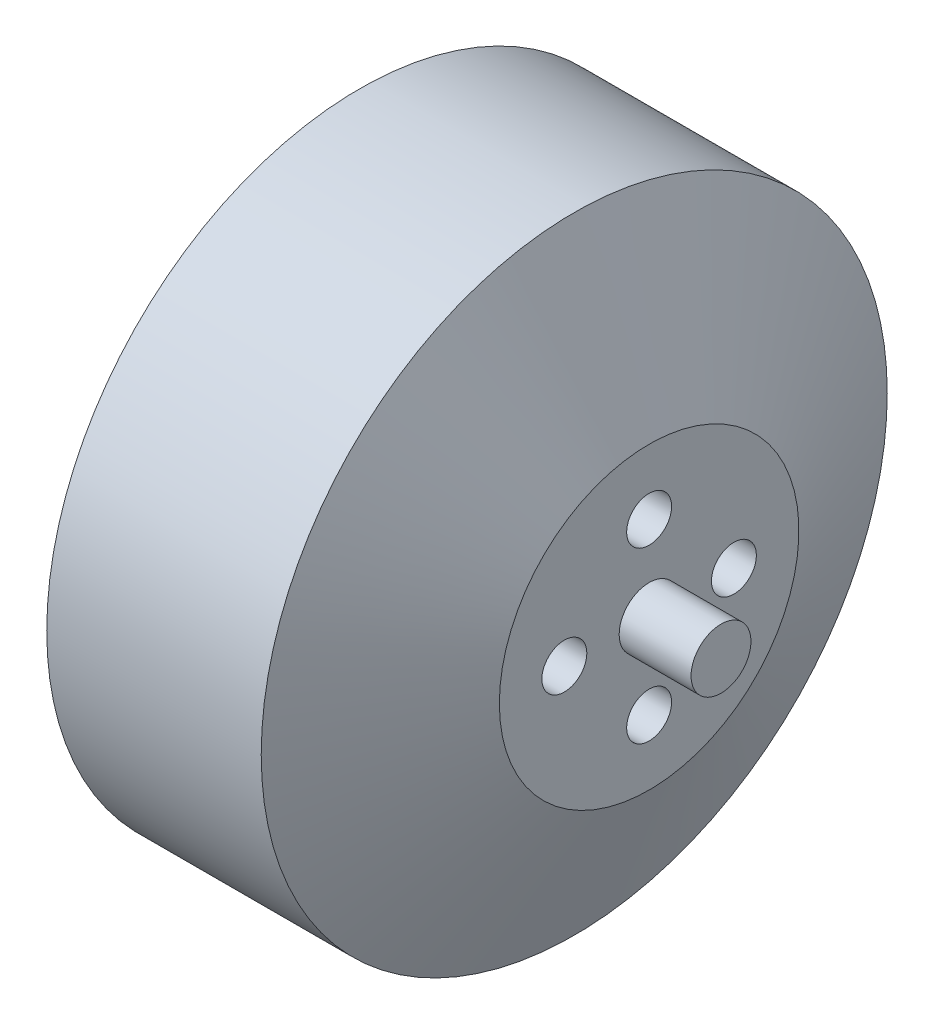
ISO-10303-21;
HEADER;
FILE_DESCRIPTION(('STEP AP214'),'2;1');
FILE_NAME('part.step','',(''),(''),'','','');
FILE_SCHEMA(('AUTOMOTIVE_DESIGN { 1 0 10303 214 1 1 1 1 }'));
ENDSEC;
DATA;
#1=APPLICATION_CONTEXT('core data for automotive mechanical design processes');
#2=APPLICATION_PROTOCOL_DEFINITION('international standard','automotive_design',2000,#1);
#3=PRODUCT_CONTEXT('',#1,'mechanical');
#4=PRODUCT('Part','Part','',(#3));
#5=PRODUCT_RELATED_PRODUCT_CATEGORY('part','',(#4));
#6=PRODUCT_DEFINITION_FORMATION('','',#4);
#7=PRODUCT_DEFINITION_CONTEXT('part definition',#1,'design');
#8=PRODUCT_DEFINITION('design','',#6,#7);
#9=PRODUCT_DEFINITION_SHAPE('','',#8);
#10=(LENGTH_UNIT() NAMED_UNIT(*) SI_UNIT(.MILLI.,.METRE.));
#11=(NAMED_UNIT(*) PLANE_ANGLE_UNIT() SI_UNIT($,.RADIAN.));
#12=(NAMED_UNIT(*) SI_UNIT($,.STERADIAN.) SOLID_ANGLE_UNIT());
#13=UNCERTAINTY_MEASURE_WITH_UNIT(LENGTH_MEASURE(1.E-05),#10,'distance_accuracy_value','');
#14=(GEOMETRIC_REPRESENTATION_CONTEXT(3) GLOBAL_UNCERTAINTY_ASSIGNED_CONTEXT((#13)) GLOBAL_UNIT_ASSIGNED_CONTEXT((#10,
#11,#12)) REPRESENTATION_CONTEXT('',''));
#15=CARTESIAN_POINT('',(0.,0.,0.));
#16=DIRECTION('',(0.,0.,1.));
#17=DIRECTION('',(1.,0.,0.));
#18=AXIS2_PLACEMENT_3D('',#15,#16,#17);
#19=CARTESIAN_POINT('',(11.82,0.,5.66));
#20=DIRECTION('',(1.,0.,0.));
#21=DIRECTION('',(0.,0.,-1.));
#22=AXIS2_PLACEMENT_3D('',#19,#20,#21);
#23=CYLINDRICAL_SURFACE('',#22,1.5);
#24=CARTESIAN_POINT('',(19.32,0.,5.66));
#25=DIRECTION('',(1.,0.,0.));
#26=DIRECTION('',(0.,0.,-1.));
#27=AXIS2_PLACEMENT_3D('',#24,#25,#26);
#28=CIRCLE('',#27,1.5);
#29=CARTESIAN_POINT('',(19.32,0.,4.16));
#30=VERTEX_POINT('',#29);
#31=EDGE_CURVE('E56',#30,#30,#28,.T.);
#32=ORIENTED_EDGE('',*,*,#31,.T.);
#33=EDGE_LOOP('',(#32));
#34=FACE_BOUND('',#33,.T.);
#35=CARTESIAN_POINT('',(14.5,0.,5.66));
#36=DIRECTION('',(-1.,0.,0.));
#37=DIRECTION('',(0.,0.,1.));
#38=AXIS2_PLACEMENT_3D('',#35,#36,#37);
#39=CIRCLE('',#38,1.5);
#40=CARTESIAN_POINT('',(14.5,0.,7.16));
#41=VERTEX_POINT('',#40);
#42=EDGE_CURVE('E68',#41,#41,#39,.F.);
#43=ORIENTED_EDGE('',*,*,#42,.F.);
#44=EDGE_LOOP('',(#43));
#45=FACE_BOUND('',#44,.T.);
#46=ADVANCED_FACE('F33',(#34,#45),#23,.F.);
#47=CARTESIAN_POINT('',(11.82,-5.66,0.));
#48=DIRECTION('',(1.,0.,0.));
#49=DIRECTION('',(0.,0.,-1.));
#50=AXIS2_PLACEMENT_3D('',#47,#48,#49);
#51=CYLINDRICAL_SURFACE('',#50,1.5);
#52=CARTESIAN_POINT('',(19.32,-5.66,0.));
#53=DIRECTION('',(1.,0.,0.));
#54=DIRECTION('',(0.,0.,1.));
#55=AXIS2_PLACEMENT_3D('',#52,#53,#54);
#56=CIRCLE('',#55,1.5);
#57=CARTESIAN_POINT('',(19.32,-5.66,1.49999999999998));
#58=VERTEX_POINT('',#57);
#59=EDGE_CURVE('E59',#58,#58,#56,.T.);
#60=ORIENTED_EDGE('',*,*,#59,.T.);
#61=EDGE_LOOP('',(#60));
#62=FACE_BOUND('',#61,.T.);
#63=CARTESIAN_POINT('',(14.5,-5.66,0.));
#64=DIRECTION('',(-1.,0.,0.));
#65=DIRECTION('',(0.,0.,1.));
#66=AXIS2_PLACEMENT_3D('',#63,#64,#65);
#67=CIRCLE('',#66,1.5);
#68=CARTESIAN_POINT('',(14.5,-5.66,1.49999999999998));
#69=VERTEX_POINT('',#68);
#70=EDGE_CURVE('E71',#69,#69,#67,.F.);
#71=ORIENTED_EDGE('',*,*,#70,.F.);
#72=EDGE_LOOP('',(#71));
#73=FACE_BOUND('',#72,.T.);
#74=ADVANCED_FACE('F101',(#62,#73),#51,.F.);
#75=CARTESIAN_POINT('',(11.82,0.,-5.66));
#76=DIRECTION('',(1.,0.,0.));
#77=DIRECTION('',(0.,0.,-1.));
#78=AXIS2_PLACEMENT_3D('',#75,#76,#77);
#79=CYLINDRICAL_SURFACE('',#78,1.5);
#80=CARTESIAN_POINT('',(19.32,0.,-5.66));
#81=DIRECTION('',(1.,0.,0.));
#82=DIRECTION('',(0.,0.,-1.));
#83=AXIS2_PLACEMENT_3D('',#80,#81,#82);
#84=CIRCLE('',#83,1.5);
#85=CARTESIAN_POINT('',(19.32,0.,-7.16));
#86=VERTEX_POINT('',#85);
#87=EDGE_CURVE('E62',#86,#86,#84,.T.);
#88=ORIENTED_EDGE('',*,*,#87,.T.);
#89=EDGE_LOOP('',(#88));
#90=FACE_BOUND('',#89,.T.);
#91=CARTESIAN_POINT('',(14.5,0.,-5.66));
#92=DIRECTION('',(-1.,0.,0.));
#93=DIRECTION('',(0.,0.,1.));
#94=AXIS2_PLACEMENT_3D('',#91,#92,#93);
#95=CIRCLE('',#94,1.5);
#96=CARTESIAN_POINT('',(14.5,0.,-4.16));
#97=VERTEX_POINT('',#96);
#98=EDGE_CURVE('E74',#97,#97,#95,.F.);
#99=ORIENTED_EDGE('',*,*,#98,.F.);
#100=EDGE_LOOP('',(#99));
#101=FACE_BOUND('',#100,.T.);
#102=ADVANCED_FACE('F92',(#90,#101),#79,.F.);
#103=CARTESIAN_POINT('',(11.82,5.66,0.));
#104=DIRECTION('',(1.,0.,0.));
#105=DIRECTION('',(0.,0.,-1.));
#106=AXIS2_PLACEMENT_3D('',#103,#104,#105);
#107=CYLINDRICAL_SURFACE('',#106,1.5);
#108=CARTESIAN_POINT('',(19.32,5.66,0.));
#109=DIRECTION('',(1.,0.,0.));
#110=DIRECTION('',(0.,0.,1.));
#111=AXIS2_PLACEMENT_3D('',#108,#109,#110);
#112=CIRCLE('',#111,1.5);
#113=CARTESIAN_POINT('',(19.32,5.66,1.50000000000002));
#114=VERTEX_POINT('',#113);
#115=EDGE_CURVE('E65',#114,#114,#112,.T.);
#116=ORIENTED_EDGE('',*,*,#115,.T.);
#117=EDGE_LOOP('',(#116));
#118=FACE_BOUND('',#117,.T.);
#119=CARTESIAN_POINT('',(14.5,5.66,0.));
#120=DIRECTION('',(-1.,0.,0.));
#121=DIRECTION('',(0.,0.,1.));
#122=AXIS2_PLACEMENT_3D('',#119,#120,#121);
#123=CIRCLE('',#122,1.5);
#124=CARTESIAN_POINT('',(14.5,5.66,1.50000000000002));
#125=VERTEX_POINT('',#124);
#126=EDGE_CURVE('E37',#125,#125,#123,.F.);
#127=ORIENTED_EDGE('',*,*,#126,.F.);
#128=EDGE_LOOP('',(#127));
#129=FACE_BOUND('',#128,.T.);
#130=ADVANCED_FACE('F90',(#118,#129),#107,.F.);
#131=CARTESIAN_POINT('',(0.,0.,0.));
#132=DIRECTION('',(1.,0.,0.));
#133=DIRECTION('',(0.,0.,-1.));
#134=AXIS2_PLACEMENT_3D('',#131,#132,#133);
#135=PLANE('',#134);
#136=CARTESIAN_POINT('',(0.,0.,0.));
#137=DIRECTION('',(-1.,0.,0.));
#138=DIRECTION('',(0.,0.,1.));
#139=AXIS2_PLACEMENT_3D('',#136,#137,#138);
#140=CIRCLE('',#139,19.4);
#141=CARTESIAN_POINT('',(0.,0.,19.4));
#142=VERTEX_POINT('',#141);
#143=EDGE_CURVE('E77',#142,#142,#140,.T.);
#144=ORIENTED_EDGE('',*,*,#143,.F.);
#145=EDGE_LOOP('',(#144));
#146=FACE_BOUND('',#145,.T.);
#147=CARTESIAN_POINT('',(0.,0.,0.));
#148=DIRECTION('',(-1.,0.,0.));
#149=DIRECTION('',(0.,0.,1.));
#150=AXIS2_PLACEMENT_3D('',#147,#148,#149);
#151=CIRCLE('',#150,20.9);
#152=CARTESIAN_POINT('',(0.,0.,20.9));
#153=VERTEX_POINT('',#152);
#154=EDGE_CURVE('E10',#153,#153,#151,.T.);
#155=ORIENTED_EDGE('',*,*,#154,.T.);
#156=EDGE_LOOP('',(#155));
#157=FACE_BOUND('',#156,.T.);
#158=ADVANCED_FACE('F35',(#146,#157),#135,.F.);
#159=CARTESIAN_POINT('',(0.,0.,0.));
#160=DIRECTION('',(-1.,0.,0.));
#161=DIRECTION('',(0.,0.,1.));
#162=AXIS2_PLACEMENT_3D('',#159,#160,#161);
#163=CYLINDRICAL_SURFACE('',#162,20.9);
#164=ORIENTED_EDGE('',*,*,#154,.F.);
#165=EDGE_LOOP('',(#164));
#166=FACE_BOUND('',#165,.T.);
#167=CARTESIAN_POINT('',(14.32,0.,0.));
#168=DIRECTION('',(-1.,0.,0.));
#169=DIRECTION('',(0.,0.,1.));
#170=AXIS2_PLACEMENT_3D('',#167,#168,#169);
#171=CIRCLE('',#170,20.9);
#172=CARTESIAN_POINT('',(14.32,0.,20.9));
#173=VERTEX_POINT('',#172);
#174=EDGE_CURVE('E41',#173,#173,#171,.T.);
#175=ORIENTED_EDGE('',*,*,#174,.T.);
#176=EDGE_LOOP('',(#175));
#177=FACE_BOUND('',#176,.T.);
#178=ADVANCED_FACE('F99',(#166,#177),#163,.T.);
#179=CARTESIAN_POINT('',(19.32,0.,0.));
#180=DIRECTION('',(-1.,0.,0.));
#181=DIRECTION('',(0.,0.,1.));
#182=AXIS2_PLACEMENT_3D('',#179,#180,#181);
#183=CONICAL_SURFACE('',#182,10.,1.14071819173903);
#184=ORIENTED_EDGE('',*,*,#174,.F.);
#185=EDGE_LOOP('',(#184));
#186=FACE_BOUND('',#185,.T.);
#187=CARTESIAN_POINT('',(19.32,0.,0.));
#188=DIRECTION('',(-1.,0.,0.));
#189=DIRECTION('',(0.,0.,1.));
#190=AXIS2_PLACEMENT_3D('',#187,#188,#189);
#191=CIRCLE('',#190,10.);
#192=CARTESIAN_POINT('',(19.32,0.,10.));
#193=VERTEX_POINT('',#192);
#194=EDGE_CURVE('E45',#193,#193,#191,.T.);
#195=ORIENTED_EDGE('',*,*,#194,.T.);
#196=EDGE_LOOP('',(#195));
#197=FACE_BOUND('',#196,.T.);
#198=ADVANCED_FACE('F126',(#186,#197),#183,.T.);
#199=CARTESIAN_POINT('',(19.32,10.,0.));
#200=DIRECTION('',(-1.,0.,0.));
#201=DIRECTION('',(0.,0.,1.));
#202=AXIS2_PLACEMENT_3D('',#199,#200,#201);
#203=PLANE('',#202);
#204=ORIENTED_EDGE('',*,*,#115,.F.);
#205=EDGE_LOOP('',(#204));
#206=FACE_BOUND('',#205,.T.);
#207=ORIENTED_EDGE('',*,*,#87,.F.);
#208=EDGE_LOOP('',(#207));
#209=FACE_BOUND('',#208,.T.);
#210=ORIENTED_EDGE('',*,*,#59,.F.);
#211=EDGE_LOOP('',(#210));
#212=FACE_BOUND('',#211,.T.);
#213=ORIENTED_EDGE('',*,*,#31,.F.);
#214=EDGE_LOOP('',(#213));
#215=FACE_BOUND('',#214,.T.);
#216=ORIENTED_EDGE('',*,*,#194,.F.);
#217=EDGE_LOOP('',(#216));
#218=FACE_BOUND('',#217,.T.);
#219=CARTESIAN_POINT('',(19.32,0.,0.));
#220=DIRECTION('',(-1.,0.,0.));
#221=DIRECTION('',(0.,0.,1.));
#222=AXIS2_PLACEMENT_3D('',#219,#220,#221);
#223=CIRCLE('',#222,2.);
#224=CARTESIAN_POINT('',(19.32,0.,2.));
#225=VERTEX_POINT('',#224);
#226=EDGE_CURVE('E50',#225,#225,#223,.T.);
#227=ORIENTED_EDGE('',*,*,#226,.T.);
#228=EDGE_LOOP('',(#227));
#229=FACE_BOUND('',#228,.T.);
#230=ADVANCED_FACE('F122',(#206,#209,#212,#215,#218,#229),#203,.F.);
#231=CARTESIAN_POINT('',(0.,0.,0.));
#232=DIRECTION('',(-1.,0.,0.));
#233=DIRECTION('',(0.,0.,1.));
#234=AXIS2_PLACEMENT_3D('',#231,#232,#233);
#235=CYLINDRICAL_SURFACE('',#234,2.);
#236=ORIENTED_EDGE('',*,*,#226,.F.);
#237=EDGE_LOOP('',(#236));
#238=FACE_BOUND('',#237,.T.);
#239=CARTESIAN_POINT('',(24.12,0.,0.));
#240=DIRECTION('',(-1.,0.,0.));
#241=DIRECTION('',(0.,0.,1.));
#242=AXIS2_PLACEMENT_3D('',#239,#240,#241);
#243=CIRCLE('',#242,2.);
#244=CARTESIAN_POINT('',(24.12,0.,2.));
#245=VERTEX_POINT('',#244);
#246=EDGE_CURVE('E53',#245,#245,#243,.T.);
#247=ORIENTED_EDGE('',*,*,#246,.T.);
#248=EDGE_LOOP('',(#247));
#249=FACE_BOUND('',#248,.T.);
#250=ADVANCED_FACE('F118',(#238,#249),#235,.T.);
#251=CARTESIAN_POINT('',(24.12,2.,0.));
#252=DIRECTION('',(-1.,0.,0.));
#253=DIRECTION('',(0.,0.,1.));
#254=AXIS2_PLACEMENT_3D('',#251,#252,#253);
#255=PLANE('',#254);
#256=ORIENTED_EDGE('',*,*,#246,.F.);
#257=EDGE_LOOP('',(#256));
#258=FACE_BOUND('',#257,.T.);
#259=ADVANCED_FACE('F115',(#258),#255,.F.);
#260=CARTESIAN_POINT('',(14.5,0.,0.));
#261=DIRECTION('',(-1.,0.,0.));
#262=DIRECTION('',(0.,0.,1.));
#263=AXIS2_PLACEMENT_3D('',#260,#261,#262);
#264=PLANE('',#263);
#265=CARTESIAN_POINT('',(14.5,0.,0.));
#266=DIRECTION('',(-1.,0.,0.));
#267=DIRECTION('',(0.,0.,1.));
#268=AXIS2_PLACEMENT_3D('',#265,#266,#267);
#269=CIRCLE('',#268,19.4);
#270=CARTESIAN_POINT('',(14.5,0.,19.4));
#271=VERTEX_POINT('',#270);
#272=EDGE_CURVE('E80',#271,#271,#269,.T.);
#273=ORIENTED_EDGE('',*,*,#272,.T.);
#274=EDGE_LOOP('',(#273));
#275=FACE_BOUND('',#274,.T.);
#276=ORIENTED_EDGE('',*,*,#126,.T.);
#277=EDGE_LOOP('',(#276));
#278=FACE_BOUND('',#277,.T.);
#279=ORIENTED_EDGE('',*,*,#98,.T.);
#280=EDGE_LOOP('',(#279));
#281=FACE_BOUND('',#280,.T.);
#282=ORIENTED_EDGE('',*,*,#70,.T.);
#283=EDGE_LOOP('',(#282));
#284=FACE_BOUND('',#283,.T.);
#285=ORIENTED_EDGE('',*,*,#42,.T.);
#286=EDGE_LOOP('',(#285));
#287=FACE_BOUND('',#286,.T.);
#288=ADVANCED_FACE('F87',(#275,#278,#281,#284,#287),#264,.T.);
#289=CARTESIAN_POINT('',(14.5,0.,0.));
#290=DIRECTION('',(-1.,0.,0.));
#291=DIRECTION('',(0.,0.,1.));
#292=AXIS2_PLACEMENT_3D('',#289,#290,#291);
#293=CYLINDRICAL_SURFACE('',#292,19.4);
#294=CARTESIAN_POINT('',(14.5,0.,19.4));
#295=CARTESIAN_POINT('',(14.3489583333333,0.,19.4));
#296=CARTESIAN_POINT('',(14.1979166666667,0.,19.4));
#297=CARTESIAN_POINT('',(13.8958333333333,0.,19.4));
#298=CARTESIAN_POINT('',(13.7447916666667,0.,19.4));
#299=CARTESIAN_POINT('',(13.4427083333333,0.,19.4));
#300=CARTESIAN_POINT('',(13.2916666666667,0.,19.4));
#301=CARTESIAN_POINT('',(12.9895833333333,0.,19.4));
#302=CARTESIAN_POINT('',(12.8385416666667,0.,19.4));
#303=CARTESIAN_POINT('',(12.5364583333333,0.,19.4));
#304=CARTESIAN_POINT('',(12.3854166666667,0.,19.4));
#305=CARTESIAN_POINT('',(12.0833333333333,0.,19.4));
#306=CARTESIAN_POINT('',(11.9322916666667,0.,19.4));
#307=CARTESIAN_POINT('',(11.6302083333333,0.,19.4));
#308=CARTESIAN_POINT('',(11.4791666666667,0.,19.4));
#309=CARTESIAN_POINT('',(11.1770833333333,0.,19.4));
#310=CARTESIAN_POINT('',(11.0260416666667,0.,19.4));
#311=CARTESIAN_POINT('',(10.7239583333333,0.,19.4));
#312=CARTESIAN_POINT('',(10.5729166666667,0.,19.4));
#313=CARTESIAN_POINT('',(10.2708333333333,0.,19.4));
#314=CARTESIAN_POINT('',(10.1197916666667,0.,19.4));
#315=CARTESIAN_POINT('',(9.81770833333333,0.,19.4));
#316=CARTESIAN_POINT('',(9.66666666666667,0.,19.4));
#317=CARTESIAN_POINT('',(9.36458333333333,0.,19.4));
#318=CARTESIAN_POINT('',(9.21354166666667,0.,19.4));
#319=CARTESIAN_POINT('',(8.91145833333334,0.,19.4));
#320=CARTESIAN_POINT('',(8.76041666666667,0.,19.4));
#321=CARTESIAN_POINT('',(8.45833333333334,0.,19.4));
#322=CARTESIAN_POINT('',(8.30729166666667,0.,19.4));
#323=CARTESIAN_POINT('',(8.00520833333333,0.,19.4));
#324=CARTESIAN_POINT('',(7.85416666666667,0.,19.4));
#325=CARTESIAN_POINT('',(7.55208333333333,0.,19.4));
#326=CARTESIAN_POINT('',(7.40104166666667,0.,19.4));
#327=CARTESIAN_POINT('',(7.09895833333333,0.,19.4));
#328=CARTESIAN_POINT('',(6.94791666666667,0.,19.4));
#329=CARTESIAN_POINT('',(6.64583333333333,0.,19.4));
#330=CARTESIAN_POINT('',(6.49479166666667,0.,19.4));
#331=CARTESIAN_POINT('',(6.19270833333333,0.,19.4));
#332=CARTESIAN_POINT('',(6.04166666666667,0.,19.4));
#333=CARTESIAN_POINT('',(5.73958333333333,0.,19.4));
#334=CARTESIAN_POINT('',(5.58854166666667,0.,19.4));
#335=CARTESIAN_POINT('',(5.28645833333333,0.,19.4));
#336=CARTESIAN_POINT('',(5.13541666666667,0.,19.4));
#337=CARTESIAN_POINT('',(4.83333333333333,0.,19.4));
#338=CARTESIAN_POINT('',(4.68229166666667,0.,19.4));
#339=CARTESIAN_POINT('',(4.38020833333333,0.,19.4));
#340=CARTESIAN_POINT('',(4.22916666666667,0.,19.4));
#341=CARTESIAN_POINT('',(3.92708333333333,0.,19.4));
#342=CARTESIAN_POINT('',(3.77604166666667,0.,19.4));
#343=CARTESIAN_POINT('',(3.47395833333333,0.,19.4));
#344=CARTESIAN_POINT('',(3.32291666666667,0.,19.4));
#345=CARTESIAN_POINT('',(3.02083333333333,0.,19.4));
#346=CARTESIAN_POINT('',(2.86979166666667,0.,19.4));
#347=CARTESIAN_POINT('',(2.56770833333333,0.,19.4));
#348=CARTESIAN_POINT('',(2.41666666666667,0.,19.4));
#349=CARTESIAN_POINT('',(2.11458333333333,0.,19.4));
#350=CARTESIAN_POINT('',(1.96354166666667,0.,19.4));
#351=CARTESIAN_POINT('',(1.66145833333333,0.,19.4));
#352=CARTESIAN_POINT('',(1.51041666666667,0.,19.4));
#353=CARTESIAN_POINT('',(1.20833333333333,0.,19.4));
#354=CARTESIAN_POINT('',(1.05729166666667,0.,19.4));
#355=CARTESIAN_POINT('',(0.755208333333334,0.,19.4));
#356=CARTESIAN_POINT('',(0.604166666666667,0.,19.4));
#357=CARTESIAN_POINT('',(0.302083333333333,0.,19.4));
#358=CARTESIAN_POINT('',(0.151041666666667,0.,19.4));
#359=CARTESIAN_POINT('',(0.,0.,19.4));
#360=B_SPLINE_CURVE_WITH_KNOTS('',3,(#294,#295,#296,#297,#298,#299,#300,#301,#302,#303,#304,
#305,#306,#307,#308,#309,#310,#311,#312,#313,#314,#315,#316,#317,#318,#319,#320,#321,#322,#323,
#324,#325,#326,#327,#328,#329,#330,#331,#332,#333,#334,#335,#336,#337,#338,#339,#340,#341,#342,
#343,#344,#345,#346,#347,#348,#349,#350,#351,#352,#353,#354,#355,#356,#357,#358,#359),
.UNSPECIFIED.,.F.,.F.,(4,2,2,2,2,2,2,2,2,2,2,2,2,2,2,2,2,2,2,2,2,2,2,2,2,2,2,2,2,2,2,2,4),(0.,
0.453124999999999,0.906249999999999,1.359375,1.8125,2.265625,2.71875,3.171875,3.625,4.078125,
4.53125,4.984375,5.4375,5.890625,6.34375,6.796875,7.25,7.703125,8.15625,8.609375,9.0625,
9.515625,9.96875,10.421875,10.875,11.328125,11.78125,12.234375,12.6875,13.140625,13.59375,
14.046875,14.5),.UNSPECIFIED.);
#361=EDGE_CURVE('BSEAM167',#271,#142,#360,.T.);
#362=ORIENTED_EDGE('',*,*,#272,.F.);
#363=ORIENTED_EDGE('',*,*,#143,.T.);
#364=ORIENTED_EDGE('',*,*,#361,.T.);
#365=ORIENTED_EDGE('',*,*,#361,.F.);
#366=EDGE_LOOP('',(#362,#364,#363,#365));
#367=FACE_BOUND('',#366,.T.);
#368=ADVANCED_FACE('F167',(#367),#293,.F.);
#369=CLOSED_SHELL('',(#46,#74,#102,#130,#158,#178,#198,#230,#250,#259,#288,#368));
#370=MANIFOLD_SOLID_BREP('B2',#369);
#371=ADVANCED_BREP_SHAPE_REPRESENTATION('',(#18,#370),#14);
#372=SHAPE_DEFINITION_REPRESENTATION(#9,#371);
ENDSEC;
END-ISO-10303-21;
